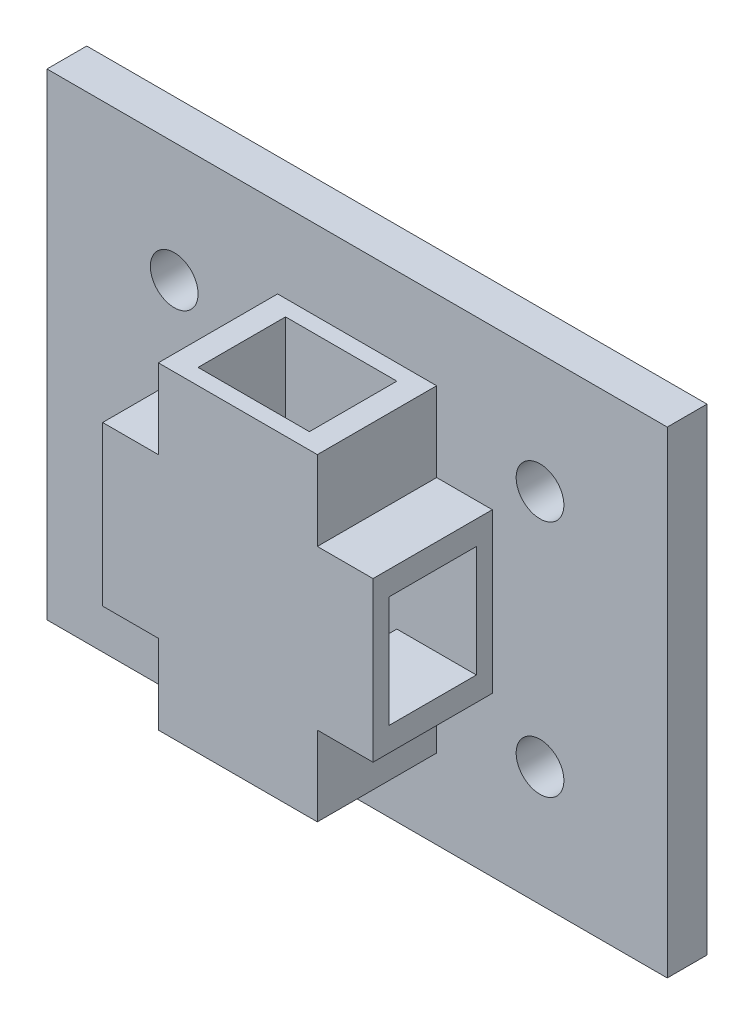
ISO-10303-21;
HEADER;
FILE_DESCRIPTION(('STEP AP214'),'2;1');
FILE_NAME('part.step','',(''),(''),'','','');
FILE_SCHEMA(('AUTOMOTIVE_DESIGN { 1 0 10303 214 1 1 1 1 }'));
ENDSEC;
DATA;
#1=APPLICATION_CONTEXT('core data for automotive mechanical design processes');
#2=APPLICATION_PROTOCOL_DEFINITION('international standard','automotive_design',2000,#1);
#3=PRODUCT_CONTEXT('',#1,'mechanical');
#4=PRODUCT('Part','Part','',(#3));
#5=PRODUCT_RELATED_PRODUCT_CATEGORY('part','',(#4));
#6=PRODUCT_DEFINITION_FORMATION('','',#4);
#7=PRODUCT_DEFINITION_CONTEXT('part definition',#1,'design');
#8=PRODUCT_DEFINITION('design','',#6,#7);
#9=PRODUCT_DEFINITION_SHAPE('','',#8);
#10=(LENGTH_UNIT() NAMED_UNIT(*) SI_UNIT(.MILLI.,.METRE.));
#11=(NAMED_UNIT(*) PLANE_ANGLE_UNIT() SI_UNIT($,.RADIAN.));
#12=(NAMED_UNIT(*) SI_UNIT($,.STERADIAN.) SOLID_ANGLE_UNIT());
#13=UNCERTAINTY_MEASURE_WITH_UNIT(LENGTH_MEASURE(1.E-05),#10,'distance_accuracy_value','');
#14=(GEOMETRIC_REPRESENTATION_CONTEXT(3) GLOBAL_UNCERTAINTY_ASSIGNED_CONTEXT((#13)) GLOBAL_UNIT_ASSIGNED_CONTEXT((#10,
#11,#12)) REPRESENTATION_CONTEXT('',''));
#15=CARTESIAN_POINT('',(0.,0.,0.));
#16=DIRECTION('',(0.,0.,1.));
#17=DIRECTION('',(1.,0.,0.));
#18=AXIS2_PLACEMENT_3D('',#15,#16,#17);
#19=CARTESIAN_POINT('',(6.78746594005453,39.1062670299727,7.));
#20=DIRECTION('',(1.,0.,0.));
#21=DIRECTION('',(0.,0.,-1.));
#22=AXIS2_PLACEMENT_3D('',#19,#20,#21);
#23=PLANE('',#22);
#24=DIRECTION('',(0.,-1.,0.));
#25=VECTOR('',#24,1.);
#26=CARTESIAN_POINT('',(6.78746594005453,39.1062670299727,18.));
#27=LINE('',#26,#25);
#28=CARTESIAN_POINT('',(6.78746594005453,2.10626702997274,18.));
#29=VERTEX_POINT('',#28);
#30=CARTESIAN_POINT('',(6.78746594005453,-10.8937329700273,18.));
#31=VERTEX_POINT('',#30);
#32=EDGE_CURVE('E317',#29,#31,#27,.T.);
#33=ORIENTED_EDGE('',*,*,#32,.F.);
#34=DIRECTION('',(0.,0.,-1.));
#35=VECTOR('',#34,1.);
#36=CARTESIAN_POINT('',(6.78746594005453,2.10626702997274,7.));
#37=LINE('',#36,#35);
#38=CARTESIAN_POINT('',(6.78746594005453,2.10626702997274,7.));
#39=VERTEX_POINT('',#38);
#40=EDGE_CURVE('E285',#29,#39,#37,.T.);
#41=ORIENTED_EDGE('',*,*,#40,.T.);
#42=DIRECTION('',(0.,-1.,0.));
#43=VECTOR('',#42,1.);
#44=CARTESIAN_POINT('',(6.78746594005453,39.1062670299727,7.));
#45=LINE('',#44,#43);
#46=CARTESIAN_POINT('',(6.78746594005453,-10.8937329700273,7.));
#47=VERTEX_POINT('',#46);
#48=EDGE_CURVE('E323',#39,#47,#45,.T.);
#49=ORIENTED_EDGE('',*,*,#48,.T.);
#50=DIRECTION('',(0.,0.,1.));
#51=VECTOR('',#50,1.);
#52=CARTESIAN_POINT('',(6.78746594005453,-10.8937329700273,7.));
#53=LINE('',#52,#51);
#54=EDGE_CURVE('E301',#47,#31,#53,.T.);
#55=ORIENTED_EDGE('',*,*,#54,.T.);
#56=EDGE_LOOP('',(#33,#41,#49,#55));
#57=FACE_BOUND('',#56,.T.);
#58=ADVANCED_FACE('F42',(#57),#23,.F.);
#59=CARTESIAN_POINT('',(-7.21253405994547,39.1062670299727,7.));
#60=DIRECTION('',(-1.,0.,0.));
#61=DIRECTION('',(0.,0.,1.));
#62=AXIS2_PLACEMENT_3D('',#59,#60,#61);
#63=PLANE('',#62);
#64=DIRECTION('',(0.,-1.,0.));
#65=VECTOR('',#64,1.);
#66=CARTESIAN_POINT('',(-7.21253405994547,39.1062670299727,7.));
#67=LINE('',#66,#65);
#68=CARTESIAN_POINT('',(-7.21253405994547,2.10626702997274,7.));
#69=VERTEX_POINT('',#68);
#70=CARTESIAN_POINT('',(-7.21253405994547,-10.8937329700273,7.));
#71=VERTEX_POINT('',#70);
#72=EDGE_CURVE('E328',#69,#71,#67,.T.);
#73=ORIENTED_EDGE('',*,*,#72,.F.);
#74=DIRECTION('',(0.,0.,1.));
#75=VECTOR('',#74,1.);
#76=CARTESIAN_POINT('',(-7.21253405994547,2.10626702997274,6.99999999999999));
#77=LINE('',#76,#75);
#78=CARTESIAN_POINT('',(-7.21253405994547,2.10626702997274,18.));
#79=VERTEX_POINT('',#78);
#80=EDGE_CURVE('E281',#69,#79,#77,.T.);
#81=ORIENTED_EDGE('',*,*,#80,.T.);
#82=DIRECTION('',(0.,-1.,0.));
#83=VECTOR('',#82,1.);
#84=CARTESIAN_POINT('',(-7.21253405994547,39.1062670299727,18.));
#85=LINE('',#84,#83);
#86=CARTESIAN_POINT('',(-7.21253405994547,-10.8937329700273,18.));
#87=VERTEX_POINT('',#86);
#88=EDGE_CURVE('E333',#79,#87,#85,.T.);
#89=ORIENTED_EDGE('',*,*,#88,.T.);
#90=DIRECTION('',(0.,0.,-1.));
#91=VECTOR('',#90,1.);
#92=CARTESIAN_POINT('',(-7.21253405994547,-10.8937329700273,7.));
#93=LINE('',#92,#91);
#94=EDGE_CURVE('E309',#87,#71,#93,.T.);
#95=ORIENTED_EDGE('',*,*,#94,.T.);
#96=EDGE_LOOP('',(#73,#81,#89,#95));
#97=FACE_BOUND('',#96,.T.);
#98=ADVANCED_FACE('F632',(#97),#63,.F.);
#99=CARTESIAN_POINT('',(-17.2125340599455,29.1062670299727,20.));
#100=DIRECTION('',(1.,0.,0.));
#101=DIRECTION('',(0.,1.,0.));
#102=AXIS2_PLACEMENT_3D('',#99,#100,#101);
#103=PLANE('',#102);
#104=DIRECTION('',(0.,0.,-1.));
#105=VECTOR('',#104,1.);
#106=CARTESIAN_POINT('',(-17.2125340599455,2.10626702997274,20.));
#107=LINE('',#106,#105);
#108=CARTESIAN_POINT('',(-17.2125340599455,2.10626702997274,18.));
#109=VERTEX_POINT('',#108);
#110=CARTESIAN_POINT('',(-17.2125340599455,2.10626702997274,7.));
#111=VERTEX_POINT('',#110);
#112=EDGE_CURVE('E289',#109,#111,#107,.T.);
#113=ORIENTED_EDGE('',*,*,#112,.T.);
#114=DIRECTION('',(0.,1.,0.));
#115=VECTOR('',#114,1.);
#116=CARTESIAN_POINT('',(-17.2125340599455,29.1062670299727,7.));
#117=LINE('',#116,#115);
#118=CARTESIAN_POINT('',(-17.2125340599455,16.1062670299727,7.));
#119=VERTEX_POINT('',#118);
#120=EDGE_CURVE('E297',#111,#119,#117,.T.);
#121=ORIENTED_EDGE('',*,*,#120,.T.);
#122=DIRECTION('',(0.,0.,1.));
#123=VECTOR('',#122,1.);
#124=CARTESIAN_POINT('',(-17.2125340599455,16.1062670299727,20.));
#125=LINE('',#124,#123);
#126=CARTESIAN_POINT('',(-17.2125340599455,16.1062670299727,18.));
#127=VERTEX_POINT('',#126);
#128=EDGE_CURVE('E277',#119,#127,#125,.T.);
#129=ORIENTED_EDGE('',*,*,#128,.T.);
#130=DIRECTION('',(0.,-1.,0.));
#131=VECTOR('',#130,1.);
#132=CARTESIAN_POINT('',(-17.2125340599455,29.1062670299727,18.));
#133=LINE('',#132,#131);
#134=EDGE_CURVE('E293',#127,#109,#133,.T.);
#135=ORIENTED_EDGE('',*,*,#134,.T.);
#136=EDGE_LOOP('',(#113,#121,#129,#135));
#137=FACE_BOUND('',#136,.T.);
#138=DIRECTION('',(0.,0.,1.));
#139=VECTOR('',#138,1.);
#140=CARTESIAN_POINT('',(-17.2125340599455,-0.893732970027254,5.));
#141=LINE('',#140,#139);
#142=CARTESIAN_POINT('',(-17.2125340599455,-0.893732970027254,5.));
#143=VERTEX_POINT('',#142);
#144=CARTESIAN_POINT('',(-17.2125340599455,-0.893732970027254,20.));
#145=VERTEX_POINT('',#144);
#146=EDGE_CURVE('E404',#143,#145,#141,.T.);
#147=ORIENTED_EDGE('',*,*,#146,.T.);
#148=DIRECTION('',(0.,-1.,0.));
#149=VECTOR('',#148,1.);
#150=CARTESIAN_POINT('',(-17.2125340599455,29.1062670299727,20.));
#151=LINE('',#150,#149);
#152=CARTESIAN_POINT('',(-17.2125340599455,19.1062670299727,20.));
#153=VERTEX_POINT('',#152);
#154=EDGE_CURVE('E436',#153,#145,#151,.T.);
#155=ORIENTED_EDGE('',*,*,#154,.F.);
#156=DIRECTION('',(0.,0.,1.));
#157=VECTOR('',#156,1.);
#158=CARTESIAN_POINT('',(-17.2125340599455,19.1062670299727,5.));
#159=LINE('',#158,#157);
#160=CARTESIAN_POINT('',(-17.2125340599455,19.1062670299727,5.));
#161=VERTEX_POINT('',#160);
#162=EDGE_CURVE('E419',#161,#153,#159,.T.);
#163=ORIENTED_EDGE('',*,*,#162,.F.);
#164=DIRECTION('',(0.,-1.,0.));
#165=VECTOR('',#164,1.);
#166=CARTESIAN_POINT('',(-17.2125340599455,29.1062670299727,5.));
#167=LINE('',#166,#165);
#168=EDGE_CURVE('E430',#161,#143,#167,.T.);
#169=ORIENTED_EDGE('',*,*,#168,.T.);
#170=EDGE_LOOP('',(#147,#155,#163,#169));
#171=FACE_BOUND('',#170,.T.);
#172=ADVANCED_FACE('F638',(#137,#171),#103,.F.);
#173=CARTESIAN_POINT('',(-17.2125340599455,-10.8937329700273,20.));
#174=DIRECTION('',(0.,1.,0.));
#175=DIRECTION('',(0.,0.,1.));
#176=AXIS2_PLACEMENT_3D('',#173,#174,#175);
#177=PLANE('',#176);
#178=DIRECTION('',(-1.,0.,0.));
#179=VECTOR('',#178,1.);
#180=CARTESIAN_POINT('',(6.78746594005453,-10.8937329700273,18.));
#181=LINE('',#180,#179);
#182=EDGE_CURVE('E305',#31,#87,#181,.T.);
#183=ORIENTED_EDGE('',*,*,#182,.F.);
#184=ORIENTED_EDGE('',*,*,#54,.F.);
#185=DIRECTION('',(1.,0.,0.));
#186=VECTOR('',#185,1.);
#187=CARTESIAN_POINT('',(6.78746594005453,-10.8937329700273,7.));
#188=LINE('',#187,#186);
#189=EDGE_CURVE('E313',#71,#47,#188,.T.);
#190=ORIENTED_EDGE('',*,*,#189,.F.);
#191=ORIENTED_EDGE('',*,*,#94,.F.);
#192=EDGE_LOOP('',(#183,#184,#190,#191));
#193=FACE_BOUND('',#192,.T.);
#194=DIRECTION('',(0.,0.,1.));
#195=VECTOR('',#194,1.);
#196=CARTESIAN_POINT('',(-10.2125340599455,-10.8937329700273,5.));
#197=LINE('',#196,#195);
#198=CARTESIAN_POINT('',(-10.2125340599455,-10.8937329700273,5.));
#199=VERTEX_POINT('',#198);
#200=CARTESIAN_POINT('',(-10.2125340599455,-10.8937329700273,20.));
#201=VERTEX_POINT('',#200);
#202=EDGE_CURVE('E376',#199,#201,#197,.T.);
#203=ORIENTED_EDGE('',*,*,#202,.F.);
#204=DIRECTION('',(1.,0.,0.));
#205=VECTOR('',#204,1.);
#206=CARTESIAN_POINT('',(-17.2125340599455,-10.8937329700273,5.));
#207=LINE('',#206,#205);
#208=CARTESIAN_POINT('',(9.78746594005453,-10.8937329700273,5.));
#209=VERTEX_POINT('',#208);
#210=EDGE_CURVE('E457',#199,#209,#207,.T.);
#211=ORIENTED_EDGE('',*,*,#210,.T.);
#212=DIRECTION('',(0.,0.,1.));
#213=VECTOR('',#212,1.);
#214=CARTESIAN_POINT('',(9.78746594005453,-10.8937329700273,5.));
#215=LINE('',#214,#213);
#216=CARTESIAN_POINT('',(9.78746594005453,-10.8937329700273,20.));
#217=VERTEX_POINT('',#216);
#218=EDGE_CURVE('E381',#209,#217,#215,.T.);
#219=ORIENTED_EDGE('',*,*,#218,.T.);
#220=DIRECTION('',(1.,0.,0.));
#221=VECTOR('',#220,1.);
#222=CARTESIAN_POINT('',(-17.2125340599455,-10.8937329700273,20.));
#223=LINE('',#222,#221);
#224=EDGE_CURVE('E440',#201,#217,#223,.T.);
#225=ORIENTED_EDGE('',*,*,#224,.F.);
#226=EDGE_LOOP('',(#203,#211,#219,#225));
#227=FACE_BOUND('',#226,.T.);
#228=ADVANCED_FACE('F548',(#193,#227),#177,.F.);
#229=CARTESIAN_POINT('',(16.7874659400545,29.1062670299727,20.));
#230=DIRECTION('',(-1.,0.,0.));
#231=DIRECTION('',(0.,-1.,0.));
#232=AXIS2_PLACEMENT_3D('',#229,#230,#231);
#233=PLANE('',#232);
#234=DIRECTION('',(0.,0.,1.));
#235=VECTOR('',#234,1.);
#236=CARTESIAN_POINT('',(16.7874659400545,16.1062670299727,7.));
#237=LINE('',#236,#235);
#238=CARTESIAN_POINT('',(16.7874659400545,16.1062670299727,7.));
#239=VERTEX_POINT('',#238);
#240=CARTESIAN_POINT('',(16.7874659400545,16.1062670299727,18.));
#241=VERTEX_POINT('',#240);
#242=EDGE_CURVE('E244',#239,#241,#237,.T.);
#243=ORIENTED_EDGE('',*,*,#242,.F.);
#244=DIRECTION('',(0.,1.,0.));
#245=VECTOR('',#244,1.);
#246=CARTESIAN_POINT('',(16.7874659400545,2.10626702997275,7.));
#247=LINE('',#246,#245);
#248=CARTESIAN_POINT('',(16.7874659400545,2.10626702997275,7.));
#249=VERTEX_POINT('',#248);
#250=EDGE_CURVE('E66',#249,#239,#247,.T.);
#251=ORIENTED_EDGE('',*,*,#250,.F.);
#252=DIRECTION('',(0.,0.,-1.));
#253=VECTOR('',#252,1.);
#254=CARTESIAN_POINT('',(16.7874659400545,2.10626702997275,7.));
#255=LINE('',#254,#253);
#256=CARTESIAN_POINT('',(16.7874659400545,2.10626702997275,18.));
#257=VERTEX_POINT('',#256);
#258=EDGE_CURVE('E253',#257,#249,#255,.T.);
#259=ORIENTED_EDGE('',*,*,#258,.F.);
#260=DIRECTION('',(0.,-1.,0.));
#261=VECTOR('',#260,1.);
#262=CARTESIAN_POINT('',(16.7874659400545,2.10626702997275,18.));
#263=LINE('',#262,#261);
#264=EDGE_CURVE('E234',#241,#257,#263,.T.);
#265=ORIENTED_EDGE('',*,*,#264,.F.);
#266=EDGE_LOOP('',(#243,#251,#259,#265));
#267=FACE_BOUND('',#266,.T.);
#268=DIRECTION('',(0.,0.,1.));
#269=VECTOR('',#268,1.);
#270=CARTESIAN_POINT('',(16.7874659400545,-0.893732970027255,5.));
#271=LINE('',#270,#269);
#272=CARTESIAN_POINT('',(16.7874659400545,-0.893732970027255,5.));
#273=VERTEX_POINT('',#272);
#274=CARTESIAN_POINT('',(16.7874659400545,-0.893732970027255,20.));
#275=VERTEX_POINT('',#274);
#276=EDGE_CURVE('E349',#273,#275,#271,.T.);
#277=ORIENTED_EDGE('',*,*,#276,.F.);
#278=DIRECTION('',(0.,1.,0.));
#279=VECTOR('',#278,1.);
#280=CARTESIAN_POINT('',(16.7874659400545,29.1062670299727,5.));
#281=LINE('',#280,#279);
#282=CARTESIAN_POINT('',(16.7874659400545,19.1062670299727,5.));
#283=VERTEX_POINT('',#282);
#284=EDGE_CURVE('E461',#273,#283,#281,.T.);
#285=ORIENTED_EDGE('',*,*,#284,.T.);
#286=DIRECTION('',(0.,0.,1.));
#287=VECTOR('',#286,1.);
#288=CARTESIAN_POINT('',(16.7874659400545,19.1062670299727,5.));
#289=LINE('',#288,#287);
#290=CARTESIAN_POINT('',(16.7874659400545,19.1062670299727,20.));
#291=VERTEX_POINT('',#290);
#292=EDGE_CURVE('E356',#283,#291,#289,.T.);
#293=ORIENTED_EDGE('',*,*,#292,.T.);
#294=DIRECTION('',(0.,1.,0.));
#295=VECTOR('',#294,1.);
#296=CARTESIAN_POINT('',(16.7874659400545,29.1062670299727,20.));
#297=LINE('',#296,#295);
#298=EDGE_CURVE('E445',#275,#291,#297,.T.);
#299=ORIENTED_EDGE('',*,*,#298,.F.);
#300=EDGE_LOOP('',(#277,#285,#293,#299));
#301=FACE_BOUND('',#300,.T.);
#302=ADVANCED_FACE('F250',(#267,#301),#233,.F.);
#303=CARTESIAN_POINT('',(-17.2125340599455,29.1062670299727,20.));
#304=DIRECTION('',(0.,-1.,0.));
#305=DIRECTION('',(0.,0.,-1.));
#306=AXIS2_PLACEMENT_3D('',#303,#304,#305);
#307=PLANE('',#306);
#308=DIRECTION('',(1.,0.,0.));
#309=VECTOR('',#308,1.);
#310=CARTESIAN_POINT('',(-17.2125340599455,29.1062670299727,7.));
#311=LINE('',#310,#309);
#312=CARTESIAN_POINT('',(-7.21253405994547,29.1062670299727,7.));
#313=VERTEX_POINT('',#312);
#314=CARTESIAN_POINT('',(6.78746594005453,29.1062670299727,7.));
#315=VERTEX_POINT('',#314);
#316=EDGE_CURVE('E51',#313,#315,#311,.T.);
#317=ORIENTED_EDGE('',*,*,#316,.T.);
#318=DIRECTION('',(0.,0.,1.));
#319=VECTOR('',#318,1.);
#320=CARTESIAN_POINT('',(6.78746594005453,29.1062670299727,20.));
#321=LINE('',#320,#319);
#322=CARTESIAN_POINT('',(6.78746594005453,29.1062670299727,18.));
#323=VERTEX_POINT('',#322);
#324=EDGE_CURVE('E11',#315,#323,#321,.T.);
#325=ORIENTED_EDGE('',*,*,#324,.T.);
#326=DIRECTION('',(-1.,0.,0.));
#327=VECTOR('',#326,1.);
#328=CARTESIAN_POINT('',(-17.2125340599455,29.1062670299727,18.));
#329=LINE('',#328,#327);
#330=CARTESIAN_POINT('',(-7.21253405994547,29.1062670299727,18.));
#331=VERTEX_POINT('',#330);
#332=EDGE_CURVE('E509',#323,#331,#329,.T.);
#333=ORIENTED_EDGE('',*,*,#332,.T.);
#334=DIRECTION('',(0.,0.,-1.));
#335=VECTOR('',#334,1.);
#336=CARTESIAN_POINT('',(-7.21253405994547,29.1062670299727,20.));
#337=LINE('',#336,#335);
#338=EDGE_CURVE('E513',#331,#313,#337,.T.);
#339=ORIENTED_EDGE('',*,*,#338,.T.);
#340=EDGE_LOOP('',(#317,#325,#333,#339));
#341=FACE_BOUND('',#340,.T.);
#342=DIRECTION('',(-1.,0.,0.));
#343=VECTOR('',#342,1.);
#344=CARTESIAN_POINT('',(-17.2125340599455,29.1062670299727,20.));
#345=LINE('',#344,#343);
#346=CARTESIAN_POINT('',(9.78746594005453,29.1062670299727,20.));
#347=VERTEX_POINT('',#346);
#348=CARTESIAN_POINT('',(-10.2125340599455,29.1062670299727,20.));
#349=VERTEX_POINT('',#348);
#350=EDGE_CURVE('E449',#347,#349,#345,.T.);
#351=ORIENTED_EDGE('',*,*,#350,.F.);
#352=DIRECTION('',(0.,0.,1.));
#353=VECTOR('',#352,1.);
#354=CARTESIAN_POINT('',(9.78746594005453,29.1062670299727,5.));
#355=LINE('',#354,#353);
#356=CARTESIAN_POINT('',(9.78746594005453,29.1062670299727,5.));
#357=VERTEX_POINT('',#356);
#358=EDGE_CURVE('E352',#357,#347,#355,.T.);
#359=ORIENTED_EDGE('',*,*,#358,.F.);
#360=DIRECTION('',(-1.,0.,0.));
#361=VECTOR('',#360,1.);
#362=CARTESIAN_POINT('',(-17.2125340599455,29.1062670299727,5.));
#363=LINE('',#362,#361);
#364=CARTESIAN_POINT('',(-10.2125340599455,29.1062670299727,5.));
#365=VERTEX_POINT('',#364);
#366=EDGE_CURVE('E441',#357,#365,#363,.T.);
#367=ORIENTED_EDGE('',*,*,#366,.T.);
#368=DIRECTION('',(0.,0.,1.));
#369=VECTOR('',#368,1.);
#370=CARTESIAN_POINT('',(-10.2125340599455,29.1062670299727,5.));
#371=LINE('',#370,#369);
#372=EDGE_CURVE('E426',#365,#349,#371,.T.);
#373=ORIENTED_EDGE('',*,*,#372,.T.);
#374=EDGE_LOOP('',(#351,#359,#367,#373));
#375=FACE_BOUND('',#374,.T.);
#376=ADVANCED_FACE('F519',(#341,#375),#307,.F.);
#377=CARTESIAN_POINT('',(0.,0.,20.));
#378=DIRECTION('',(0.,0.,1.));
#379=DIRECTION('',(1.,0.,0.));
#380=AXIS2_PLACEMENT_3D('',#377,#378,#379);
#381=PLANE('',#380);
#382=DIRECTION('',(1.,0.,0.));
#383=VECTOR('',#382,1.);
#384=CARTESIAN_POINT('',(0.,-0.893732970027255,20.));
#385=LINE('',#384,#383);
#386=CARTESIAN_POINT('',(-10.2125340599455,-0.893732970027254,20.));
#387=VERTEX_POINT('',#386);
#388=EDGE_CURVE('E392',#145,#387,#385,.T.);
#389=ORIENTED_EDGE('',*,*,#388,.T.);
#390=DIRECTION('',(0.,-1.,0.));
#391=VECTOR('',#390,1.);
#392=CARTESIAN_POINT('',(-10.2125340599455,0.,20.));
#393=LINE('',#392,#391);
#394=EDGE_CURVE('E322',#387,#201,#393,.T.);
#395=ORIENTED_EDGE('',*,*,#394,.T.);
#396=ORIENTED_EDGE('',*,*,#224,.T.);
#397=DIRECTION('',(0.,-1.,0.));
#398=VECTOR('',#397,1.);
#399=CARTESIAN_POINT('',(9.78746594005453,0.,20.));
#400=LINE('',#399,#398);
#401=CARTESIAN_POINT('',(9.78746594005453,-0.893732970027255,20.));
#402=VERTEX_POINT('',#401);
#403=EDGE_CURVE('E367',#402,#217,#400,.T.);
#404=ORIENTED_EDGE('',*,*,#403,.F.);
#405=DIRECTION('',(1.,0.,0.));
#406=VECTOR('',#405,1.);
#407=CARTESIAN_POINT('',(0.,-0.893732970027253,20.));
#408=LINE('',#407,#406);
#409=EDGE_CURVE('E372',#402,#275,#408,.T.);
#410=ORIENTED_EDGE('',*,*,#409,.T.);
#411=ORIENTED_EDGE('',*,*,#298,.T.);
#412=DIRECTION('',(1.,0.,0.));
#413=VECTOR('',#412,1.);
#414=CARTESIAN_POINT('',(0.,19.1062670299727,20.));
#415=LINE('',#414,#413);
#416=CARTESIAN_POINT('',(9.78746594005453,19.1062670299727,20.));
#417=VERTEX_POINT('',#416);
#418=EDGE_CURVE('E341',#417,#291,#415,.T.);
#419=ORIENTED_EDGE('',*,*,#418,.F.);
#420=DIRECTION('',(0.,-1.,0.));
#421=VECTOR('',#420,1.);
#422=CARTESIAN_POINT('',(9.78746594005453,0.,20.));
#423=LINE('',#422,#421);
#424=EDGE_CURVE('E346',#347,#417,#423,.T.);
#425=ORIENTED_EDGE('',*,*,#424,.F.);
#426=ORIENTED_EDGE('',*,*,#350,.T.);
#427=DIRECTION('',(0.,-1.,0.));
#428=VECTOR('',#427,1.);
#429=CARTESIAN_POINT('',(-10.2125340599455,0.,20.));
#430=LINE('',#429,#428);
#431=CARTESIAN_POINT('',(-10.2125340599455,19.1062670299727,20.));
#432=VERTEX_POINT('',#431);
#433=EDGE_CURVE('E416',#349,#432,#430,.T.);
#434=ORIENTED_EDGE('',*,*,#433,.T.);
#435=DIRECTION('',(1.,0.,0.));
#436=VECTOR('',#435,1.);
#437=CARTESIAN_POINT('',(0.,19.1062670299727,20.));
#438=LINE('',#437,#436);
#439=EDGE_CURVE('E355',#153,#432,#438,.T.);
#440=ORIENTED_EDGE('',*,*,#439,.F.);
#441=ORIENTED_EDGE('',*,*,#154,.T.);
#442=EDGE_LOOP('',(#389,#395,#396,#404,#410,#411,#419,#425,#426,#434,#440,#441));
#443=FACE_BOUND('',#442,.T.);
#444=ADVANCED_FACE('F668',(#443),#381,.T.);
#445=CARTESIAN_POINT('',(-39.2125340599455,39.1062670299727,5.));
#446=DIRECTION('',(1.,0.,0.));
#447=DIRECTION('',(0.,0.,-1.));
#448=AXIS2_PLACEMENT_3D('',#445,#446,#447);
#449=PLANE('',#448);
#450=DIRECTION('',(0.,-1.,0.));
#451=VECTOR('',#450,1.);
#452=CARTESIAN_POINT('',(-39.2125340599455,39.1062670299727,0.));
#453=LINE('',#452,#451);
#454=CARTESIAN_POINT('',(-39.2125340599455,39.1062670299727,0.));
#455=VERTEX_POINT('',#454);
#456=CARTESIAN_POINT('',(-39.2125340599455,-20.8937329700273,0.));
#457=VERTEX_POINT('',#456);
#458=EDGE_CURVE('E453',#455,#457,#453,.T.);
#459=ORIENTED_EDGE('',*,*,#458,.T.);
#460=DIRECTION('',(0.,0.,-1.));
#461=VECTOR('',#460,1.);
#462=CARTESIAN_POINT('',(-39.2125340599455,-20.8937329700273,5.));
#463=LINE('',#462,#461);
#464=CARTESIAN_POINT('',(-39.2125340599455,-20.8937329700273,5.));
#465=VERTEX_POINT('',#464);
#466=EDGE_CURVE('E505',#465,#457,#463,.T.);
#467=ORIENTED_EDGE('',*,*,#466,.F.);
#468=DIRECTION('',(0.,-1.,0.));
#469=VECTOR('',#468,1.);
#470=CARTESIAN_POINT('',(-39.2125340599455,39.1062670299727,5.));
#471=LINE('',#470,#469);
#472=CARTESIAN_POINT('',(-39.2125340599455,39.1062670299727,5.));
#473=VERTEX_POINT('',#472);
#474=EDGE_CURVE('E468',#473,#465,#471,.T.);
#475=ORIENTED_EDGE('',*,*,#474,.F.);
#476=DIRECTION('',(0.,0.,-1.));
#477=VECTOR('',#476,1.);
#478=CARTESIAN_POINT('',(-39.2125340599455,39.1062670299727,5.));
#479=LINE('',#478,#477);
#480=EDGE_CURVE('E482',#473,#455,#479,.T.);
#481=ORIENTED_EDGE('',*,*,#480,.T.);
#482=EDGE_LOOP('',(#459,#467,#475,#481));
#483=FACE_BOUND('',#482,.T.);
#484=ADVANCED_FACE('F44',(#483),#449,.F.);
#485=CARTESIAN_POINT('',(-39.2125340599455,-20.8937329700273,5.));
#486=DIRECTION('',(0.,1.,0.));
#487=DIRECTION('',(0.,0.,1.));
#488=AXIS2_PLACEMENT_3D('',#485,#486,#487);
#489=PLANE('',#488);
#490=DIRECTION('',(1.,0.,0.));
#491=VECTOR('',#490,1.);
#492=CARTESIAN_POINT('',(-39.2125340599455,-20.8937329700273,0.));
#493=LINE('',#492,#491);
#494=CARTESIAN_POINT('',(38.7874659400545,-20.8937329700273,0.));
#495=VERTEX_POINT('',#494);
#496=EDGE_CURVE('E486',#457,#495,#493,.T.);
#497=ORIENTED_EDGE('',*,*,#496,.T.);
#498=DIRECTION('',(0.,0.,-1.));
#499=VECTOR('',#498,1.);
#500=CARTESIAN_POINT('',(38.7874659400545,-20.8937329700273,5.));
#501=LINE('',#500,#499);
#502=CARTESIAN_POINT('',(38.7874659400545,-20.8937329700273,5.));
#503=VERTEX_POINT('',#502);
#504=EDGE_CURVE('E501',#503,#495,#501,.T.);
#505=ORIENTED_EDGE('',*,*,#504,.F.);
#506=DIRECTION('',(1.,0.,0.));
#507=VECTOR('',#506,1.);
#508=CARTESIAN_POINT('',(-39.2125340599455,-20.8937329700273,5.));
#509=LINE('',#508,#507);
#510=EDGE_CURVE('E472',#465,#503,#509,.T.);
#511=ORIENTED_EDGE('',*,*,#510,.F.);
#512=ORIENTED_EDGE('',*,*,#466,.T.);
#513=EDGE_LOOP('',(#497,#505,#511,#512));
#514=FACE_BOUND('',#513,.T.);
#515=ADVANCED_FACE('F610',(#514),#489,.F.);
#516=CARTESIAN_POINT('',(38.7874659400545,39.1062670299727,5.));
#517=DIRECTION('',(-1.,0.,0.));
#518=DIRECTION('',(0.,-1.,0.));
#519=AXIS2_PLACEMENT_3D('',#516,#517,#518);
#520=PLANE('',#519);
#521=DIRECTION('',(0.,1.,0.));
#522=VECTOR('',#521,1.);
#523=CARTESIAN_POINT('',(38.7874659400545,39.1062670299727,0.));
#524=LINE('',#523,#522);
#525=CARTESIAN_POINT('',(38.7874659400545,39.1062670299727,0.));
#526=VERTEX_POINT('',#525);
#527=EDGE_CURVE('E489',#495,#526,#524,.T.);
#528=ORIENTED_EDGE('',*,*,#527,.T.);
#529=DIRECTION('',(0.,0.,-1.));
#530=VECTOR('',#529,1.);
#531=CARTESIAN_POINT('',(38.7874659400545,39.1062670299727,5.));
#532=LINE('',#531,#530);
#533=CARTESIAN_POINT('',(38.7874659400545,39.1062670299727,5.));
#534=VERTEX_POINT('',#533);
#535=EDGE_CURVE('E497',#534,#526,#532,.T.);
#536=ORIENTED_EDGE('',*,*,#535,.F.);
#537=DIRECTION('',(0.,1.,0.));
#538=VECTOR('',#537,1.);
#539=CARTESIAN_POINT('',(38.7874659400545,39.1062670299727,5.));
#540=LINE('',#539,#538);
#541=EDGE_CURVE('E476',#503,#534,#540,.T.);
#542=ORIENTED_EDGE('',*,*,#541,.F.);
#543=ORIENTED_EDGE('',*,*,#504,.T.);
#544=EDGE_LOOP('',(#528,#536,#542,#543));
#545=FACE_BOUND('',#544,.T.);
#546=ADVANCED_FACE('F615',(#545),#520,.F.);
#547=CARTESIAN_POINT('',(-39.2125340599455,39.1062670299727,5.));
#548=DIRECTION('',(0.,-1.,0.));
#549=DIRECTION('',(0.,0.,-1.));
#550=AXIS2_PLACEMENT_3D('',#547,#548,#549);
#551=PLANE('',#550);
#552=DIRECTION('',(-1.,0.,0.));
#553=VECTOR('',#552,1.);
#554=CARTESIAN_POINT('',(-39.2125340599455,39.1062670299727,0.));
#555=LINE('',#554,#553);
#556=EDGE_CURVE('E473',#526,#455,#555,.T.);
#557=ORIENTED_EDGE('',*,*,#556,.T.);
#558=ORIENTED_EDGE('',*,*,#480,.F.);
#559=DIRECTION('',(-1.,0.,0.));
#560=VECTOR('',#559,1.);
#561=CARTESIAN_POINT('',(-39.2125340599455,39.1062670299727,5.));
#562=LINE('',#561,#560);
#563=EDGE_CURVE('E479',#534,#473,#562,.T.);
#564=ORIENTED_EDGE('',*,*,#563,.F.);
#565=ORIENTED_EDGE('',*,*,#535,.T.);
#566=EDGE_LOOP('',(#557,#558,#564,#565));
#567=FACE_BOUND('',#566,.T.);
#568=ADVANCED_FACE('F594',(#567),#551,.F.);
#569=CARTESIAN_POINT('',(0.,0.,5.));
#570=DIRECTION('',(0.,0.,1.));
#571=DIRECTION('',(1.,0.,0.));
#572=AXIS2_PLACEMENT_3D('',#569,#570,#571);
#573=PLANE('',#572);
#574=CARTESIAN_POINT('',(-23.2125340599455,24.1062670299727,5.));
#575=DIRECTION('',(0.,0.,1.));
#576=DIRECTION('',(1.,0.,0.));
#577=AXIS2_PLACEMENT_3D('',#574,#575,#576);
#578=CIRCLE('',#577,3.);
#579=CARTESIAN_POINT('',(-20.2125340599455,24.1062670299727,5.));
#580=VERTEX_POINT('',#579);
#581=EDGE_CURVE('E562',#580,#580,#578,.T.);
#582=ORIENTED_EDGE('',*,*,#581,.F.);
#583=EDGE_LOOP('',(#582));
#584=FACE_BOUND('',#583,.T.);
#585=CARTESIAN_POINT('',(22.7874659400545,-5.89373297002725,5.));
#586=DIRECTION('',(0.,0.,1.));
#587=DIRECTION('',(1.,0.,0.));
#588=AXIS2_PLACEMENT_3D('',#585,#586,#587);
#589=CIRCLE('',#588,3.);
#590=CARTESIAN_POINT('',(25.7874659400545,-5.89373297002725,5.));
#591=VERTEX_POINT('',#590);
#592=EDGE_CURVE('E568',#591,#591,#589,.T.);
#593=ORIENTED_EDGE('',*,*,#592,.F.);
#594=EDGE_LOOP('',(#593));
#595=FACE_BOUND('',#594,.T.);
#596=CARTESIAN_POINT('',(-23.2125340599455,-5.89373297002725,5.));
#597=DIRECTION('',(0.,0.,1.));
#598=DIRECTION('',(1.,0.,0.));
#599=AXIS2_PLACEMENT_3D('',#596,#597,#598);
#600=CIRCLE('',#599,3.);
#601=CARTESIAN_POINT('',(-20.2125340599455,-5.89373297002725,5.));
#602=VERTEX_POINT('',#601);
#603=EDGE_CURVE('E569',#602,#602,#600,.T.);
#604=ORIENTED_EDGE('',*,*,#603,.F.);
#605=EDGE_LOOP('',(#604));
#606=FACE_BOUND('',#605,.T.);
#607=CARTESIAN_POINT('',(22.7874659400545,24.1062670299727,5.));
#608=DIRECTION('',(0.,0.,1.));
#609=DIRECTION('',(1.,0.,0.));
#610=AXIS2_PLACEMENT_3D('',#607,#608,#609);
#611=CIRCLE('',#610,3.);
#612=CARTESIAN_POINT('',(25.7874659400545,24.1062670299727,5.));
#613=VERTEX_POINT('',#612);
#614=EDGE_CURVE('E557',#613,#613,#611,.T.);
#615=ORIENTED_EDGE('',*,*,#614,.F.);
#616=EDGE_LOOP('',(#615));
#617=FACE_BOUND('',#616,.T.);
#618=ORIENTED_EDGE('',*,*,#168,.F.);
#619=DIRECTION('',(1.,0.,0.));
#620=VECTOR('',#619,1.);
#621=CARTESIAN_POINT('',(0.,19.1062670299727,5.));
#622=LINE('',#621,#620);
#623=CARTESIAN_POINT('',(-10.2125340599455,19.1062670299727,5.));
#624=VERTEX_POINT('',#623);
#625=EDGE_CURVE('E411',#161,#624,#622,.T.);
#626=ORIENTED_EDGE('',*,*,#625,.T.);
#627=DIRECTION('',(0.,-1.,0.));
#628=VECTOR('',#627,1.);
#629=CARTESIAN_POINT('',(-10.2125340599455,0.,5.));
#630=LINE('',#629,#628);
#631=EDGE_CURVE('E415',#365,#624,#630,.T.);
#632=ORIENTED_EDGE('',*,*,#631,.F.);
#633=ORIENTED_EDGE('',*,*,#366,.F.);
#634=DIRECTION('',(0.,-1.,0.));
#635=VECTOR('',#634,1.);
#636=CARTESIAN_POINT('',(9.78746594005453,0.,5.));
#637=LINE('',#636,#635);
#638=CARTESIAN_POINT('',(9.78746594005453,19.1062670299727,5.));
#639=VERTEX_POINT('',#638);
#640=EDGE_CURVE('E336',#357,#639,#637,.T.);
#641=ORIENTED_EDGE('',*,*,#640,.T.);
#642=DIRECTION('',(1.,0.,0.));
#643=VECTOR('',#642,1.);
#644=CARTESIAN_POINT('',(0.,19.1062670299727,5.));
#645=LINE('',#644,#643);
#646=EDGE_CURVE('E340',#639,#283,#645,.T.);
#647=ORIENTED_EDGE('',*,*,#646,.T.);
#648=ORIENTED_EDGE('',*,*,#284,.F.);
#649=DIRECTION('',(1.,0.,0.));
#650=VECTOR('',#649,1.);
#651=CARTESIAN_POINT('',(0.,-0.893732970027253,5.));
#652=LINE('',#651,#650);
#653=CARTESIAN_POINT('',(9.78746594005453,-0.893732970027255,5.));
#654=VERTEX_POINT('',#653);
#655=EDGE_CURVE('E363',#654,#273,#652,.T.);
#656=ORIENTED_EDGE('',*,*,#655,.F.);
#657=DIRECTION('',(0.,-1.,0.));
#658=VECTOR('',#657,1.);
#659=CARTESIAN_POINT('',(9.78746594005453,0.,5.));
#660=LINE('',#659,#658);
#661=EDGE_CURVE('E366',#654,#209,#660,.T.);
#662=ORIENTED_EDGE('',*,*,#661,.T.);
#663=ORIENTED_EDGE('',*,*,#210,.F.);
#664=DIRECTION('',(0.,-1.,0.));
#665=VECTOR('',#664,1.);
#666=CARTESIAN_POINT('',(-10.2125340599455,0.,5.));
#667=LINE('',#666,#665);
#668=CARTESIAN_POINT('',(-10.2125340599455,-0.893732970027254,5.));
#669=VERTEX_POINT('',#668);
#670=EDGE_CURVE('E388',#669,#199,#667,.T.);
#671=ORIENTED_EDGE('',*,*,#670,.F.);
#672=DIRECTION('',(1.,0.,0.));
#673=VECTOR('',#672,1.);
#674=CARTESIAN_POINT('',(0.,-0.893732970027255,5.));
#675=LINE('',#674,#673);
#676=EDGE_CURVE('E391',#143,#669,#675,.T.);
#677=ORIENTED_EDGE('',*,*,#676,.F.);
#678=EDGE_LOOP('',(#618,#626,#632,#633,#641,#647,#648,#656,#662,#663,#671,#677));
#679=FACE_BOUND('',#678,.T.);
#680=ORIENTED_EDGE('',*,*,#474,.T.);
#681=ORIENTED_EDGE('',*,*,#510,.T.);
#682=ORIENTED_EDGE('',*,*,#541,.T.);
#683=ORIENTED_EDGE('',*,*,#563,.T.);
#684=EDGE_LOOP('',(#680,#681,#682,#683));
#685=FACE_BOUND('',#684,.T.);
#686=ADVANCED_FACE('F590',(#584,#595,#606,#617,#679,#685),#573,.T.);
#687=CARTESIAN_POINT('',(0.,0.,0.));
#688=DIRECTION('',(0.,0.,1.));
#689=DIRECTION('',(1.,0.,0.));
#690=AXIS2_PLACEMENT_3D('',#687,#688,#689);
#691=PLANE('',#690);
#692=CARTESIAN_POINT('',(-23.2125340599455,24.1062670299727,0.));
#693=DIRECTION('',(0.,0.,1.));
#694=DIRECTION('',(1.,0.,0.));
#695=AXIS2_PLACEMENT_3D('',#692,#693,#694);
#696=CIRCLE('',#695,3.);
#697=CARTESIAN_POINT('',(-20.2125340599455,24.1062670299727,0.));
#698=VERTEX_POINT('',#697);
#699=EDGE_CURVE('E573',#698,#698,#696,.T.);
#700=ORIENTED_EDGE('',*,*,#699,.T.);
#701=EDGE_LOOP('',(#700));
#702=FACE_BOUND('',#701,.T.);
#703=CARTESIAN_POINT('',(22.7874659400545,-5.89373297002725,0.));
#704=DIRECTION('',(0.,0.,1.));
#705=DIRECTION('',(1.,0.,0.));
#706=AXIS2_PLACEMENT_3D('',#703,#704,#705);
#707=CIRCLE('',#706,3.);
#708=CARTESIAN_POINT('',(25.7874659400545,-5.89373297002725,0.));
#709=VERTEX_POINT('',#708);
#710=EDGE_CURVE('E564',#709,#709,#707,.T.);
#711=ORIENTED_EDGE('',*,*,#710,.T.);
#712=EDGE_LOOP('',(#711));
#713=FACE_BOUND('',#712,.T.);
#714=CARTESIAN_POINT('',(-23.2125340599455,-5.89373297002725,0.));
#715=DIRECTION('',(0.,0.,1.));
#716=DIRECTION('',(1.,0.,0.));
#717=AXIS2_PLACEMENT_3D('',#714,#715,#716);
#718=CIRCLE('',#717,3.);
#719=CARTESIAN_POINT('',(-20.2125340599455,-5.89373297002725,0.));
#720=VERTEX_POINT('',#719);
#721=EDGE_CURVE('E580',#720,#720,#718,.T.);
#722=ORIENTED_EDGE('',*,*,#721,.T.);
#723=EDGE_LOOP('',(#722));
#724=FACE_BOUND('',#723,.T.);
#725=CARTESIAN_POINT('',(22.7874659400545,24.1062670299727,0.));
#726=DIRECTION('',(0.,0.,1.));
#727=DIRECTION('',(1.,0.,0.));
#728=AXIS2_PLACEMENT_3D('',#725,#726,#727);
#729=CIRCLE('',#728,3.);
#730=CARTESIAN_POINT('',(25.7874659400545,24.1062670299727,0.));
#731=VERTEX_POINT('',#730);
#732=EDGE_CURVE('E554',#731,#731,#729,.T.);
#733=ORIENTED_EDGE('',*,*,#732,.T.);
#734=EDGE_LOOP('',(#733));
#735=FACE_BOUND('',#734,.T.);
#736=ORIENTED_EDGE('',*,*,#458,.F.);
#737=ORIENTED_EDGE('',*,*,#556,.F.);
#738=ORIENTED_EDGE('',*,*,#527,.F.);
#739=ORIENTED_EDGE('',*,*,#496,.F.);
#740=EDGE_LOOP('',(#736,#737,#738,#739));
#741=FACE_BOUND('',#740,.T.);
#742=ADVANCED_FACE('F593',(#702,#713,#724,#735,#741),#691,.F.);
#743=CARTESIAN_POINT('',(-10.2125340599455,0.,5.));
#744=DIRECTION('',(-1.,0.,0.));
#745=DIRECTION('',(0.,-1.,0.));
#746=AXIS2_PLACEMENT_3D('',#743,#744,#745);
#747=PLANE('',#746);
#748=ORIENTED_EDGE('',*,*,#433,.F.);
#749=ORIENTED_EDGE('',*,*,#372,.F.);
#750=ORIENTED_EDGE('',*,*,#631,.T.);
#751=DIRECTION('',(0.,0.,1.));
#752=VECTOR('',#751,1.);
#753=CARTESIAN_POINT('',(-10.2125340599455,19.1062670299727,5.));
#754=LINE('',#753,#752);
#755=EDGE_CURVE('E431',#624,#432,#754,.T.);
#756=ORIENTED_EDGE('',*,*,#755,.T.);
#757=EDGE_LOOP('',(#748,#749,#750,#756));
#758=FACE_BOUND('',#757,.T.);
#759=ADVANCED_FACE('F620',(#758),#747,.T.);
#760=CARTESIAN_POINT('',(0.,19.1062670299727,5.));
#761=DIRECTION('',(0.,-1.,0.));
#762=DIRECTION('',(0.,0.,-1.));
#763=AXIS2_PLACEMENT_3D('',#760,#761,#762);
#764=PLANE('',#763);
#765=ORIENTED_EDGE('',*,*,#439,.T.);
#766=ORIENTED_EDGE('',*,*,#755,.F.);
#767=ORIENTED_EDGE('',*,*,#625,.F.);
#768=ORIENTED_EDGE('',*,*,#162,.T.);
#769=EDGE_LOOP('',(#765,#766,#767,#768));
#770=FACE_BOUND('',#769,.T.);
#771=ADVANCED_FACE('F626',(#770),#764,.F.);
#772=CARTESIAN_POINT('',(9.78746594005453,0.,5.));
#773=DIRECTION('',(-1.,0.,0.));
#774=DIRECTION('',(0.,0.,1.));
#775=AXIS2_PLACEMENT_3D('',#772,#773,#774);
#776=PLANE('',#775);
#777=ORIENTED_EDGE('',*,*,#424,.T.);
#778=DIRECTION('',(0.,0.,1.));
#779=VECTOR('',#778,1.);
#780=CARTESIAN_POINT('',(9.78746594005453,19.1062670299727,5.));
#781=LINE('',#780,#779);
#782=EDGE_CURVE('E345',#639,#417,#781,.T.);
#783=ORIENTED_EDGE('',*,*,#782,.F.);
#784=ORIENTED_EDGE('',*,*,#640,.F.);
#785=ORIENTED_EDGE('',*,*,#358,.T.);
#786=EDGE_LOOP('',(#777,#783,#784,#785));
#787=FACE_BOUND('',#786,.T.);
#788=ADVANCED_FACE('F666',(#787),#776,.F.);
#789=CARTESIAN_POINT('',(0.,19.1062670299727,5.));
#790=DIRECTION('',(0.,-1.,0.));
#791=DIRECTION('',(0.,0.,-1.));
#792=AXIS2_PLACEMENT_3D('',#789,#790,#791);
#793=PLANE('',#792);
#794=ORIENTED_EDGE('',*,*,#418,.T.);
#795=ORIENTED_EDGE('',*,*,#292,.F.);
#796=ORIENTED_EDGE('',*,*,#646,.F.);
#797=ORIENTED_EDGE('',*,*,#782,.T.);
#798=EDGE_LOOP('',(#794,#795,#796,#797));
#799=FACE_BOUND('',#798,.T.);
#800=ADVANCED_FACE('F696',(#799),#793,.F.);
#801=CARTESIAN_POINT('',(0.,-0.893732970027253,5.));
#802=DIRECTION('',(0.,-1.,0.));
#803=DIRECTION('',(1.,0.,0.));
#804=AXIS2_PLACEMENT_3D('',#801,#802,#803);
#805=PLANE('',#804);
#806=ORIENTED_EDGE('',*,*,#409,.F.);
#807=DIRECTION('',(0.,0.,1.));
#808=VECTOR('',#807,1.);
#809=CARTESIAN_POINT('',(9.78746594005453,-0.893732970027255,5.));
#810=LINE('',#809,#808);
#811=EDGE_CURVE('E371',#654,#402,#810,.T.);
#812=ORIENTED_EDGE('',*,*,#811,.F.);
#813=ORIENTED_EDGE('',*,*,#655,.T.);
#814=ORIENTED_EDGE('',*,*,#276,.T.);
#815=EDGE_LOOP('',(#806,#812,#813,#814));
#816=FACE_BOUND('',#815,.T.);
#817=ADVANCED_FACE('F661',(#816),#805,.T.);
#818=CARTESIAN_POINT('',(9.78746594005453,0.,5.));
#819=DIRECTION('',(-1.,0.,0.));
#820=DIRECTION('',(0.,0.,1.));
#821=AXIS2_PLACEMENT_3D('',#818,#819,#820);
#822=PLANE('',#821);
#823=ORIENTED_EDGE('',*,*,#403,.T.);
#824=ORIENTED_EDGE('',*,*,#218,.F.);
#825=ORIENTED_EDGE('',*,*,#661,.F.);
#826=ORIENTED_EDGE('',*,*,#811,.T.);
#827=EDGE_LOOP('',(#823,#824,#825,#826));
#828=FACE_BOUND('',#827,.T.);
#829=ADVANCED_FACE('F657',(#828),#822,.F.);
#830=CARTESIAN_POINT('',(-10.2125340599455,0.,5.));
#831=DIRECTION('',(-1.,0.,0.));
#832=DIRECTION('',(0.,-1.,0.));
#833=AXIS2_PLACEMENT_3D('',#830,#831,#832);
#834=PLANE('',#833);
#835=ORIENTED_EDGE('',*,*,#394,.F.);
#836=DIRECTION('',(0.,0.,1.));
#837=VECTOR('',#836,1.);
#838=CARTESIAN_POINT('',(-10.2125340599455,-0.893732970027254,5.));
#839=LINE('',#838,#837);
#840=EDGE_CURVE('E395',#669,#387,#839,.T.);
#841=ORIENTED_EDGE('',*,*,#840,.F.);
#842=ORIENTED_EDGE('',*,*,#670,.T.);
#843=ORIENTED_EDGE('',*,*,#202,.T.);
#844=EDGE_LOOP('',(#835,#841,#842,#843));
#845=FACE_BOUND('',#844,.T.);
#846=ADVANCED_FACE('F651',(#845),#834,.T.);
#847=CARTESIAN_POINT('',(0.,-0.893732970027255,5.));
#848=DIRECTION('',(0.,-1.,0.));
#849=DIRECTION('',(1.,0.,0.));
#850=AXIS2_PLACEMENT_3D('',#847,#848,#849);
#851=PLANE('',#850);
#852=ORIENTED_EDGE('',*,*,#388,.F.);
#853=ORIENTED_EDGE('',*,*,#146,.F.);
#854=ORIENTED_EDGE('',*,*,#676,.T.);
#855=ORIENTED_EDGE('',*,*,#840,.T.);
#856=EDGE_LOOP('',(#852,#853,#854,#855));
#857=FACE_BOUND('',#856,.T.);
#858=ADVANCED_FACE('F644',(#857),#851,.T.);
#859=CARTESIAN_POINT('',(6.78746594005453,16.1062670299727,7.));
#860=VERTEX_POINT('',#859);
#861=EDGE_CURVE('E318',#315,#860,#45,.T.);
#862=ORIENTED_EDGE('',*,*,#861,.T.);
#863=DIRECTION('',(0.,0.,1.));
#864=VECTOR('',#863,1.);
#865=CARTESIAN_POINT('',(6.78746594005453,16.1062670299727,7.));
#866=LINE('',#865,#864);
#867=CARTESIAN_POINT('',(6.78746594005453,16.1062670299727,18.));
#868=VERTEX_POINT('',#867);
#869=EDGE_CURVE('E274',#860,#868,#866,.T.);
#870=ORIENTED_EDGE('',*,*,#869,.T.);
#871=EDGE_CURVE('E237',#323,#868,#27,.T.);
#872=ORIENTED_EDGE('',*,*,#871,.F.);
#873=ORIENTED_EDGE('',*,*,#324,.F.);
#874=EDGE_LOOP('',(#862,#870,#872,#873));
#875=FACE_BOUND('',#874,.T.);
#876=ADVANCED_FACE('F634',(#875),#23,.F.);
#877=CARTESIAN_POINT('',(6.78746594005453,39.1062670299727,7.));
#878=DIRECTION('',(0.,0.,-1.));
#879=DIRECTION('',(-1.,0.,0.));
#880=AXIS2_PLACEMENT_3D('',#877,#878,#879);
#881=PLANE('',#880);
#882=CARTESIAN_POINT('',(-7.21253405994547,16.1062670299727,7.));
#883=VERTEX_POINT('',#882);
#884=EDGE_CURVE('E324',#313,#883,#67,.T.);
#885=ORIENTED_EDGE('',*,*,#884,.T.);
#886=DIRECTION('',(1.,0.,0.));
#887=VECTOR('',#886,1.);
#888=CARTESIAN_POINT('',(-39.2125340599455,16.1062670299727,7.));
#889=LINE('',#888,#887);
#890=EDGE_CURVE('E241',#119,#883,#889,.T.);
#891=ORIENTED_EDGE('',*,*,#890,.F.);
#892=ORIENTED_EDGE('',*,*,#120,.F.);
#893=DIRECTION('',(1.,0.,0.));
#894=VECTOR('',#893,1.);
#895=CARTESIAN_POINT('',(-39.2125340599455,2.10626702997274,7.));
#896=LINE('',#895,#894);
#897=EDGE_CURVE('E263',#111,#69,#896,.T.);
#898=ORIENTED_EDGE('',*,*,#897,.T.);
#899=ORIENTED_EDGE('',*,*,#72,.T.);
#900=ORIENTED_EDGE('',*,*,#189,.T.);
#901=ORIENTED_EDGE('',*,*,#48,.F.);
#902=EDGE_CURVE('E260',#39,#249,#896,.T.);
#903=ORIENTED_EDGE('',*,*,#902,.T.);
#904=ORIENTED_EDGE('',*,*,#250,.T.);
#905=EDGE_CURVE('E246',#860,#239,#889,.T.);
#906=ORIENTED_EDGE('',*,*,#905,.F.);
#907=ORIENTED_EDGE('',*,*,#861,.F.);
#908=ORIENTED_EDGE('',*,*,#316,.F.);
#909=EDGE_LOOP('',(#885,#891,#892,#898,#899,#900,#901,#903,#904,#906,#907,#908));
#910=FACE_BOUND('',#909,.T.);
#911=ADVANCED_FACE('F524',(#910),#881,.F.);
#912=CARTESIAN_POINT('',(-7.21253405994547,16.1062670299727,18.));
#913=VERTEX_POINT('',#912);
#914=EDGE_CURVE('E329',#331,#913,#85,.T.);
#915=ORIENTED_EDGE('',*,*,#914,.T.);
#916=DIRECTION('',(0.,0.,-1.));
#917=VECTOR('',#916,1.);
#918=CARTESIAN_POINT('',(-7.21253405994547,16.1062670299727,7.));
#919=LINE('',#918,#917);
#920=EDGE_CURVE('E270',#913,#883,#919,.T.);
#921=ORIENTED_EDGE('',*,*,#920,.T.);
#922=ORIENTED_EDGE('',*,*,#884,.F.);
#923=ORIENTED_EDGE('',*,*,#338,.F.);
#924=EDGE_LOOP('',(#915,#921,#922,#923));
#925=FACE_BOUND('',#924,.T.);
#926=ADVANCED_FACE('F527',(#925),#63,.F.);
#927=CARTESIAN_POINT('',(6.78746594005453,39.1062670299727,18.));
#928=DIRECTION('',(0.,0.,1.));
#929=DIRECTION('',(1.,0.,0.));
#930=AXIS2_PLACEMENT_3D('',#927,#928,#929);
#931=PLANE('',#930);
#932=ORIENTED_EDGE('',*,*,#871,.T.);
#933=DIRECTION('',(1.,0.,0.));
#934=VECTOR('',#933,1.);
#935=CARTESIAN_POINT('',(-39.2125340599455,16.1062670299727,18.));
#936=LINE('',#935,#934);
#937=EDGE_CURVE('E229',#868,#241,#936,.T.);
#938=ORIENTED_EDGE('',*,*,#937,.T.);
#939=ORIENTED_EDGE('',*,*,#264,.T.);
#940=DIRECTION('',(1.,0.,0.));
#941=VECTOR('',#940,1.);
#942=CARTESIAN_POINT('',(-39.2125340599455,2.10626702997274,18.));
#943=LINE('',#942,#941);
#944=EDGE_CURVE('E265',#29,#257,#943,.T.);
#945=ORIENTED_EDGE('',*,*,#944,.F.);
#946=ORIENTED_EDGE('',*,*,#32,.T.);
#947=ORIENTED_EDGE('',*,*,#182,.T.);
#948=ORIENTED_EDGE('',*,*,#88,.F.);
#949=EDGE_CURVE('E264',#109,#79,#943,.T.);
#950=ORIENTED_EDGE('',*,*,#949,.F.);
#951=ORIENTED_EDGE('',*,*,#134,.F.);
#952=EDGE_CURVE('E58',#127,#913,#936,.T.);
#953=ORIENTED_EDGE('',*,*,#952,.T.);
#954=ORIENTED_EDGE('',*,*,#914,.F.);
#955=ORIENTED_EDGE('',*,*,#332,.F.);
#956=EDGE_LOOP('',(#932,#938,#939,#945,#946,#947,#948,#950,#951,#953,#954,#955));
#957=FACE_BOUND('',#956,.T.);
#958=ADVANCED_FACE('F231',(#957),#931,.F.);
#959=CARTESIAN_POINT('',(-39.2125340599455,16.1062670299727,7.));
#960=DIRECTION('',(0.,1.,0.));
#961=DIRECTION('',(-1.,0.,0.));
#962=AXIS2_PLACEMENT_3D('',#959,#960,#961);
#963=PLANE('',#962);
#964=ORIENTED_EDGE('',*,*,#890,.T.);
#965=ORIENTED_EDGE('',*,*,#920,.F.);
#966=ORIENTED_EDGE('',*,*,#952,.F.);
#967=ORIENTED_EDGE('',*,*,#128,.F.);
#968=EDGE_LOOP('',(#964,#965,#966,#967));
#969=FACE_BOUND('',#968,.T.);
#970=ADVANCED_FACE('F528',(#969),#963,.F.);
#971=CARTESIAN_POINT('',(-39.2125340599455,2.10626702997274,7.));
#972=DIRECTION('',(0.,-1.,0.));
#973=DIRECTION('',(1.,0.,0.));
#974=AXIS2_PLACEMENT_3D('',#971,#972,#973);
#975=PLANE('',#974);
#976=ORIENTED_EDGE('',*,*,#949,.T.);
#977=ORIENTED_EDGE('',*,*,#80,.F.);
#978=ORIENTED_EDGE('',*,*,#897,.F.);
#979=ORIENTED_EDGE('',*,*,#112,.F.);
#980=EDGE_LOOP('',(#976,#977,#978,#979));
#981=FACE_BOUND('',#980,.T.);
#982=ADVANCED_FACE('F907',(#981),#975,.F.);
#983=ORIENTED_EDGE('',*,*,#944,.T.);
#984=ORIENTED_EDGE('',*,*,#258,.T.);
#985=ORIENTED_EDGE('',*,*,#902,.F.);
#986=ORIENTED_EDGE('',*,*,#40,.F.);
#987=EDGE_LOOP('',(#983,#984,#985,#986));
#988=FACE_BOUND('',#987,.T.);
#989=ADVANCED_FACE('F552',(#988),#975,.F.);
#990=ORIENTED_EDGE('',*,*,#905,.T.);
#991=ORIENTED_EDGE('',*,*,#242,.T.);
#992=ORIENTED_EDGE('',*,*,#937,.F.);
#993=ORIENTED_EDGE('',*,*,#869,.F.);
#994=EDGE_LOOP('',(#990,#991,#992,#993));
#995=FACE_BOUND('',#994,.T.);
#996=ADVANCED_FACE('F245',(#995),#963,.F.);
#997=CARTESIAN_POINT('',(22.7874659400545,24.1062670299727,0.));
#998=DIRECTION('',(0.,0.,1.));
#999=DIRECTION('',(1.,0.,0.));
#1000=AXIS2_PLACEMENT_3D('',#997,#998,#999);
#1001=CYLINDRICAL_SURFACE('',#1000,3.);
#1002=ORIENTED_EDGE('',*,*,#732,.F.);
#1003=EDGE_LOOP('',(#1002));
#1004=FACE_BOUND('',#1003,.T.);
#1005=ORIENTED_EDGE('',*,*,#614,.T.);
#1006=EDGE_LOOP('',(#1005));
#1007=FACE_BOUND('',#1006,.T.);
#1008=ADVANCED_FACE('F932',(#1004,#1007),#1001,.F.);
#1009=CARTESIAN_POINT('',(-23.2125340599455,-5.89373297002725,0.));
#1010=DIRECTION('',(0.,0.,1.));
#1011=DIRECTION('',(1.,0.,0.));
#1012=AXIS2_PLACEMENT_3D('',#1009,#1010,#1011);
#1013=CYLINDRICAL_SURFACE('',#1012,3.);
#1014=ORIENTED_EDGE('',*,*,#721,.F.);
#1015=EDGE_LOOP('',(#1014));
#1016=FACE_BOUND('',#1015,.T.);
#1017=ORIENTED_EDGE('',*,*,#603,.T.);
#1018=EDGE_LOOP('',(#1017));
#1019=FACE_BOUND('',#1018,.T.);
#1020=ADVANCED_FACE('F588',(#1016,#1019),#1013,.F.);
#1021=CARTESIAN_POINT('',(22.7874659400545,-5.89373297002725,0.));
#1022=DIRECTION('',(0.,0.,1.));
#1023=DIRECTION('',(1.,0.,0.));
#1024=AXIS2_PLACEMENT_3D('',#1021,#1022,#1023);
#1025=CYLINDRICAL_SURFACE('',#1024,3.);
#1026=ORIENTED_EDGE('',*,*,#710,.F.);
#1027=EDGE_LOOP('',(#1026));
#1028=FACE_BOUND('',#1027,.T.);
#1029=ORIENTED_EDGE('',*,*,#592,.T.);
#1030=EDGE_LOOP('',(#1029));
#1031=FACE_BOUND('',#1030,.T.);
#1032=ADVANCED_FACE('F947',(#1028,#1031),#1025,.F.);
#1033=CARTESIAN_POINT('',(-23.2125340599455,24.1062670299727,0.));
#1034=DIRECTION('',(0.,0.,1.));
#1035=DIRECTION('',(1.,0.,0.));
#1036=AXIS2_PLACEMENT_3D('',#1033,#1034,#1035);
#1037=CYLINDRICAL_SURFACE('',#1036,3.);
#1038=ORIENTED_EDGE('',*,*,#699,.F.);
#1039=EDGE_LOOP('',(#1038));
#1040=FACE_BOUND('',#1039,.T.);
#1041=ORIENTED_EDGE('',*,*,#581,.T.);
#1042=EDGE_LOOP('',(#1041));
#1043=FACE_BOUND('',#1042,.T.);
#1044=ADVANCED_FACE('F957',(#1040,#1043),#1037,.F.);
#1045=CLOSED_SHELL('',(#58,#98,#172,#228,#302,#376,#444,#484,#515,#546,#568,#686,#742,#759,#771,
#788,#800,#817,#829,#846,#858,#876,#911,#926,#958,#970,#982,#989,#996,#1008,#1020,#1032,#1044));
#1046=MANIFOLD_SOLID_BREP('B2',#1045);
#1047=ADVANCED_BREP_SHAPE_REPRESENTATION('',(#18,#1046),#14);
#1048=SHAPE_DEFINITION_REPRESENTATION(#9,#1047);
ENDSEC;
END-ISO-10303-21;
